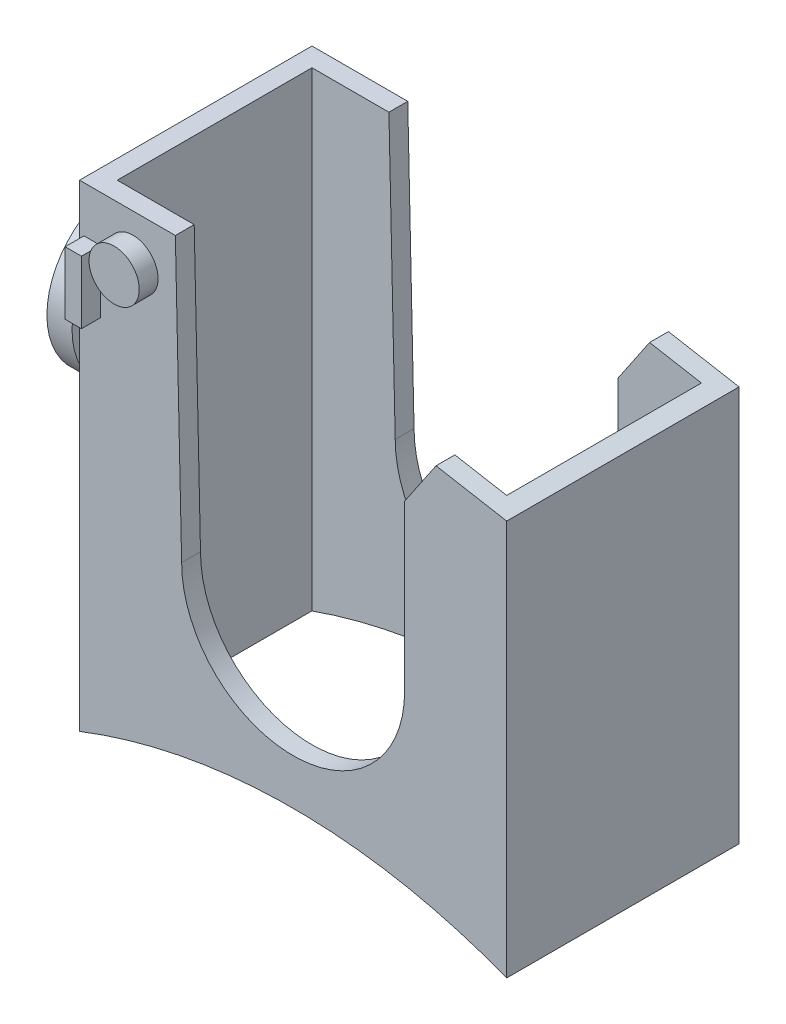
ISO-10303-21;
HEADER;
FILE_DESCRIPTION(('STEP AP214'),'2;1');
FILE_NAME('part.step','',(''),(''),'','','');
FILE_SCHEMA(('AUTOMOTIVE_DESIGN { 1 0 10303 214 1 1 1 1 }'));
ENDSEC;
DATA;
#1=APPLICATION_CONTEXT('core data for automotive mechanical design processes');
#2=APPLICATION_PROTOCOL_DEFINITION('international standard','automotive_design',2000,#1);
#3=PRODUCT_CONTEXT('',#1,'mechanical');
#4=PRODUCT('Part','Part','',(#3));
#5=PRODUCT_RELATED_PRODUCT_CATEGORY('part','',(#4));
#6=PRODUCT_DEFINITION_FORMATION('','',#4);
#7=PRODUCT_DEFINITION_CONTEXT('part definition',#1,'design');
#8=PRODUCT_DEFINITION('design','',#6,#7);
#9=PRODUCT_DEFINITION_SHAPE('','',#8);
#10=(LENGTH_UNIT() NAMED_UNIT(*) SI_UNIT(.MILLI.,.METRE.));
#11=(NAMED_UNIT(*) PLANE_ANGLE_UNIT() SI_UNIT($,.RADIAN.));
#12=(NAMED_UNIT(*) SI_UNIT($,.STERADIAN.) SOLID_ANGLE_UNIT());
#13=UNCERTAINTY_MEASURE_WITH_UNIT(LENGTH_MEASURE(1.E-05),#10,'distance_accuracy_value','');
#14=(GEOMETRIC_REPRESENTATION_CONTEXT(3) GLOBAL_UNCERTAINTY_ASSIGNED_CONTEXT((#13)) GLOBAL_UNIT_ASSIGNED_CONTEXT((#10,
#11,#12)) REPRESENTATION_CONTEXT('',''));
#15=CARTESIAN_POINT('',(0.,0.,0.));
#16=DIRECTION('',(0.,0.,1.));
#17=DIRECTION('',(1.,0.,0.));
#18=AXIS2_PLACEMENT_3D('',#15,#16,#17);
#19=CARTESIAN_POINT('',(0.,0.,18.5));
#20=DIRECTION('',(0.,0.,1.));
#21=DIRECTION('',(1.,0.,0.));
#22=AXIS2_PLACEMENT_3D('',#19,#20,#21);
#23=PLANE('',#22);
#24=CARTESIAN_POINT('',(-25.5,37.27,18.5));
#25=DIRECTION('',(0.,0.,1.));
#26=DIRECTION('',(1.,0.,0.));
#27=AXIS2_PLACEMENT_3D('',#24,#25,#26);
#28=CIRCLE('',#27,4.);
#29=CARTESIAN_POINT('',(-21.5,37.27,18.5));
#30=VERTEX_POINT('',#29);
#31=EDGE_CURVE('E813',#30,#30,#28,.T.);
#32=ORIENTED_EDGE('',*,*,#31,.F.);
#33=EDGE_LOOP('',(#32));
#34=FACE_BOUND('',#33,.T.);
#35=DIRECTION('',(-1.,0.,0.));
#36=VECTOR('',#35,1.);
#37=CARTESIAN_POINT('',(-34.,44.6,18.5));
#38=LINE('',#37,#36);
#39=CARTESIAN_POINT('',(-18.75,44.6,18.5));
#40=VERTEX_POINT('',#39);
#41=CARTESIAN_POINT('',(-34.,44.6,18.5));
#42=VERTEX_POINT('',#41);
#43=EDGE_CURVE('E309',#40,#42,#38,.T.);
#44=ORIENTED_EDGE('',*,*,#43,.T.);
#45=DIRECTION('',(0.,-1.,0.));
#46=VECTOR('',#45,1.);
#47=CARTESIAN_POINT('',(-34.,44.6,18.5));
#48=LINE('',#47,#46);
#49=CARTESIAN_POINT('',(-34.,-31.4,18.5));
#50=VERTEX_POINT('',#49);
#51=EDGE_CURVE('E313',#42,#50,#48,.T.);
#52=ORIENTED_EDGE('',*,*,#51,.T.);
#53=CARTESIAN_POINT('',(0.,-118.5125,18.5));
#54=DIRECTION('',(0.,0.,-1.));
#55=DIRECTION('',(-1.,0.,0.));
#56=AXIS2_PLACEMENT_3D('',#53,#54,#55);
#57=CIRCLE('',#56,93.5124999999999);
#58=CARTESIAN_POINT('',(34.,-31.4,18.5));
#59=VERTEX_POINT('',#58);
#60=EDGE_CURVE('E317',#50,#59,#57,.T.);
#61=ORIENTED_EDGE('',*,*,#60,.T.);
#62=DIRECTION('',(0.,1.,0.));
#63=VECTOR('',#62,1.);
#64=CARTESIAN_POINT('',(34.,-31.4,18.5));
#65=LINE('',#64,#63);
#66=CARTESIAN_POINT('',(34.,31.6,18.5));
#67=VERTEX_POINT('',#66);
#68=EDGE_CURVE('E320',#59,#67,#65,.T.);
#69=ORIENTED_EDGE('',*,*,#68,.T.);
#70=DIRECTION('',(-0.984562507785907,0.175033334717493,0.));
#71=VECTOR('',#70,1.);
#72=CARTESIAN_POINT('',(22.75,33.6,18.5));
#73=LINE('',#72,#71);
#74=CARTESIAN_POINT('',(22.75,33.6,18.5));
#75=VERTEX_POINT('',#74);
#76=EDGE_CURVE('E323',#67,#75,#73,.T.);
#77=ORIENTED_EDGE('',*,*,#76,.T.);
#78=DIRECTION('',(-0.560657409563094,-0.828047866431646,0.));
#79=VECTOR('',#78,1.);
#80=CARTESIAN_POINT('',(17.75,26.2153846153846,18.5));
#81=LINE('',#80,#79);
#82=CARTESIAN_POINT('',(17.75,26.2153846153846,18.5));
#83=VERTEX_POINT('',#82);
#84=EDGE_CURVE('E326',#75,#83,#81,.T.);
#85=ORIENTED_EDGE('',*,*,#84,.T.);
#86=DIRECTION('',(0.,-1.,0.));
#87=VECTOR('',#86,1.);
#88=CARTESIAN_POINT('',(17.75,0.,18.5));
#89=LINE('',#88,#87);
#90=CARTESIAN_POINT('',(17.75,0.,18.5));
#91=VERTEX_POINT('',#90);
#92=EDGE_CURVE('E329',#83,#91,#89,.T.);
#93=ORIENTED_EDGE('',*,*,#92,.T.);
#94=CARTESIAN_POINT('',(0.,0.,18.5));
#95=DIRECTION('',(0.,0.,-1.));
#96=DIRECTION('',(1.,0.,0.));
#97=AXIS2_PLACEMENT_3D('',#94,#95,#96);
#98=CIRCLE('',#97,17.75);
#99=CARTESIAN_POINT('',(-17.75,0.,18.5));
#100=VERTEX_POINT('',#99);
#101=EDGE_CURVE('E332',#91,#100,#98,.T.);
#102=ORIENTED_EDGE('',*,*,#101,.T.);
#103=DIRECTION('',(-0.022415890859883,0.999748732350763,0.));
#104=VECTOR('',#103,1.);
#105=CARTESIAN_POINT('',(-18.75,44.6,18.5));
#106=LINE('',#105,#104);
#107=EDGE_CURVE('E335',#100,#40,#106,.T.);
#108=ORIENTED_EDGE('',*,*,#107,.T.);
#109=EDGE_LOOP('',(#44,#52,#61,#69,#77,#85,#93,#102,#108));
#110=FACE_BOUND('',#109,.T.);
#111=DIRECTION('',(1.,0.,0.));
#112=VECTOR('',#111,1.);
#113=CARTESIAN_POINT('',(-33.3,27.27,18.5));
#114=LINE('',#113,#112);
#115=CARTESIAN_POINT('',(-33.3,27.27,18.5));
#116=VERTEX_POINT('',#115);
#117=CARTESIAN_POINT('',(-30.7,27.27,18.5));
#118=VERTEX_POINT('',#117);
#119=EDGE_CURVE('E817',#116,#118,#114,.T.);
#120=ORIENTED_EDGE('',*,*,#119,.F.);
#121=DIRECTION('',(0.,-1.,0.));
#122=VECTOR('',#121,1.);
#123=CARTESIAN_POINT('',(-33.3,37.27,18.5));
#124=LINE('',#123,#122);
#125=CARTESIAN_POINT('',(-33.3,37.27,18.5));
#126=VERTEX_POINT('',#125);
#127=EDGE_CURVE('E213',#126,#116,#124,.T.);
#128=ORIENTED_EDGE('',*,*,#127,.F.);
#129=DIRECTION('',(-1.,0.,0.));
#130=VECTOR('',#129,1.);
#131=CARTESIAN_POINT('',(-33.3,37.27,18.5));
#132=LINE('',#131,#130);
#133=CARTESIAN_POINT('',(-30.7,37.27,18.5));
#134=VERTEX_POINT('',#133);
#135=EDGE_CURVE('E209',#134,#126,#132,.T.);
#136=ORIENTED_EDGE('',*,*,#135,.F.);
#137=DIRECTION('',(0.,1.,0.));
#138=VECTOR('',#137,1.);
#139=CARTESIAN_POINT('',(-30.7,37.27,18.5));
#140=LINE('',#139,#138);
#141=EDGE_CURVE('E829',#118,#134,#140,.T.);
#142=ORIENTED_EDGE('',*,*,#141,.F.);
#143=EDGE_LOOP('',(#120,#128,#136,#142));
#144=FACE_BOUND('',#143,.T.);
#145=ADVANCED_FACE('F39',(#34,#110,#144),#23,.T.);
#146=CARTESIAN_POINT('',(-34.,44.6,18.5));
#147=DIRECTION('',(0.,-1.,0.));
#148=DIRECTION('',(0.,0.,-1.));
#149=AXIS2_PLACEMENT_3D('',#146,#147,#148);
#150=PLANE('',#149);
#151=DIRECTION('',(1.,0.,0.));
#152=VECTOR('',#151,1.);
#153=CARTESIAN_POINT('',(-34.,44.6,15.5));
#154=LINE('',#153,#152);
#155=CARTESIAN_POINT('',(-31.,44.6,15.5));
#156=VERTEX_POINT('',#155);
#157=CARTESIAN_POINT('',(-18.75,44.6,15.5));
#158=VERTEX_POINT('',#157);
#159=EDGE_CURVE('E295',#156,#158,#154,.T.);
#160=ORIENTED_EDGE('',*,*,#159,.F.);
#161=DIRECTION('',(0.,0.,1.));
#162=VECTOR('',#161,1.);
#163=CARTESIAN_POINT('',(-31.,44.6,18.5));
#164=LINE('',#163,#162);
#165=CARTESIAN_POINT('',(-31.,44.6,-15.5));
#166=VERTEX_POINT('',#165);
#167=EDGE_CURVE('E305',#166,#156,#164,.T.);
#168=ORIENTED_EDGE('',*,*,#167,.F.);
#169=DIRECTION('',(1.,0.,0.));
#170=VECTOR('',#169,1.);
#171=CARTESIAN_POINT('',(-34.,44.6,-15.5));
#172=LINE('',#171,#170);
#173=CARTESIAN_POINT('',(-18.75,44.6,-15.5));
#174=VERTEX_POINT('',#173);
#175=EDGE_CURVE('E275',#166,#174,#172,.T.);
#176=ORIENTED_EDGE('',*,*,#175,.T.);
#177=DIRECTION('',(0.,0.,-1.));
#178=VECTOR('',#177,1.);
#179=CARTESIAN_POINT('',(-18.75,44.6,18.5));
#180=LINE('',#179,#178);
#181=CARTESIAN_POINT('',(-18.75,44.6,-18.5));
#182=VERTEX_POINT('',#181);
#183=EDGE_CURVE('E338',#174,#182,#180,.T.);
#184=ORIENTED_EDGE('',*,*,#183,.T.);
#185=DIRECTION('',(-1.,0.,0.));
#186=VECTOR('',#185,1.);
#187=CARTESIAN_POINT('',(-34.,44.6,-18.5));
#188=LINE('',#187,#186);
#189=CARTESIAN_POINT('',(-34.,44.6,-18.5));
#190=VERTEX_POINT('',#189);
#191=EDGE_CURVE('E308',#182,#190,#188,.T.);
#192=ORIENTED_EDGE('',*,*,#191,.T.);
#193=DIRECTION('',(0.,0.,-1.));
#194=VECTOR('',#193,1.);
#195=CARTESIAN_POINT('',(-34.,44.6,18.5));
#196=LINE('',#195,#194);
#197=EDGE_CURVE('E406',#42,#190,#196,.T.);
#198=ORIENTED_EDGE('',*,*,#197,.F.);
#199=ORIENTED_EDGE('',*,*,#43,.F.);
#200=EDGE_CURVE('E370',#40,#158,#180,.T.);
#201=ORIENTED_EDGE('',*,*,#200,.T.);
#202=EDGE_LOOP('',(#160,#168,#176,#184,#192,#198,#199,#201));
#203=FACE_BOUND('',#202,.T.);
#204=ADVANCED_FACE('F41',(#203),#150,.F.);
#205=CARTESIAN_POINT('',(0.,-118.5125,18.5));
#206=DIRECTION('',(0.,0.,-1.));
#207=DIRECTION('',(-1.,0.,0.));
#208=AXIS2_PLACEMENT_3D('',#205,#206,#207);
#209=CYLINDRICAL_SURFACE('',#208,93.5124999999999);
#210=CARTESIAN_POINT('',(0.,-118.5125,-18.5));
#211=DIRECTION('',(0.,0.,-1.));
#212=DIRECTION('',(-1.,0.,0.));
#213=AXIS2_PLACEMENT_3D('',#210,#211,#212);
#214=CIRCLE('',#213,93.5124999999999);
#215=CARTESIAN_POINT('',(-34.,-31.4,-18.5));
#216=VERTEX_POINT('',#215);
#217=CARTESIAN_POINT('',(34.,-31.4,-18.5));
#218=VERTEX_POINT('',#217);
#219=EDGE_CURVE('E345',#216,#218,#214,.T.);
#220=ORIENTED_EDGE('',*,*,#219,.T.);
#221=DIRECTION('',(0.,0.,-1.));
#222=VECTOR('',#221,1.);
#223=CARTESIAN_POINT('',(34.,-31.4,18.5));
#224=LINE('',#223,#222);
#225=EDGE_CURVE('E398',#59,#218,#224,.T.);
#226=ORIENTED_EDGE('',*,*,#225,.F.);
#227=ORIENTED_EDGE('',*,*,#60,.F.);
#228=DIRECTION('',(0.,0.,-1.));
#229=VECTOR('',#228,1.);
#230=CARTESIAN_POINT('',(-34.,-31.4,18.5));
#231=LINE('',#230,#229);
#232=EDGE_CURVE('E402',#50,#216,#231,.T.);
#233=ORIENTED_EDGE('',*,*,#232,.T.);
#234=EDGE_LOOP('',(#220,#226,#227,#233));
#235=FACE_BOUND('',#234,.T.);
#236=CARTESIAN_POINT('',(0.,-118.5125,15.5));
#237=DIRECTION('',(0.,0.,-1.));
#238=DIRECTION('',(-1.,0.,0.));
#239=AXIS2_PLACEMENT_3D('',#236,#237,#238);
#240=CIRCLE('',#239,93.5124999999999);
#241=CARTESIAN_POINT('',(31.,-30.2878568652726,15.5));
#242=VERTEX_POINT('',#241);
#243=CARTESIAN_POINT('',(-31.,-30.2878568652726,15.5));
#244=VERTEX_POINT('',#243);
#245=EDGE_CURVE('E298',#242,#244,#240,.F.);
#246=ORIENTED_EDGE('',*,*,#245,.F.);
#247=DIRECTION('',(0.,0.,-1.));
#248=VECTOR('',#247,1.);
#249=CARTESIAN_POINT('',(31.,-30.2878568652726,18.5));
#250=LINE('',#249,#248);
#251=CARTESIAN_POINT('',(31.,-30.2878568652726,-15.5));
#252=VERTEX_POINT('',#251);
#253=EDGE_CURVE('E301',#242,#252,#250,.T.);
#254=ORIENTED_EDGE('',*,*,#253,.T.);
#255=CARTESIAN_POINT('',(0.,-118.5125,-15.5));
#256=DIRECTION('',(0.,0.,-1.));
#257=DIRECTION('',(-1.,0.,0.));
#258=AXIS2_PLACEMENT_3D('',#255,#256,#257);
#259=CIRCLE('',#258,93.5124999999999);
#260=CARTESIAN_POINT('',(-31.,-30.2878568652726,-15.5));
#261=VERTEX_POINT('',#260);
#262=EDGE_CURVE('E279',#252,#261,#259,.F.);
#263=ORIENTED_EDGE('',*,*,#262,.T.);
#264=DIRECTION('',(0.,0.,-1.));
#265=VECTOR('',#264,1.);
#266=CARTESIAN_POINT('',(-31.,-30.2878568652726,18.5));
#267=LINE('',#266,#265);
#268=EDGE_CURVE('E11',#244,#261,#267,.T.);
#269=ORIENTED_EDGE('',*,*,#268,.F.);
#270=EDGE_LOOP('',(#246,#254,#263,#269));
#271=FACE_BOUND('',#270,.T.);
#272=ADVANCED_FACE('F431',(#235,#271),#209,.F.);
#273=CARTESIAN_POINT('',(22.75,33.6,18.5));
#274=DIRECTION('',(-0.175033334717493,-0.984562507785907,0.));
#275=DIRECTION('',(0.984562507785907,-0.175033334717493,0.));
#276=AXIS2_PLACEMENT_3D('',#273,#274,#275);
#277=PLANE('',#276);
#278=DIRECTION('',(0.984562507785907,-0.175033334717493,0.));
#279=VECTOR('',#278,1.);
#280=CARTESIAN_POINT('',(22.75,33.6,15.5));
#281=LINE('',#280,#279);
#282=CARTESIAN_POINT('',(22.75,33.6,15.5));
#283=VERTEX_POINT('',#282);
#284=CARTESIAN_POINT('',(31.,32.1333333333333,15.5));
#285=VERTEX_POINT('',#284);
#286=EDGE_CURVE('E292',#283,#285,#281,.T.);
#287=ORIENTED_EDGE('',*,*,#286,.F.);
#288=DIRECTION('',(0.,0.,-1.));
#289=VECTOR('',#288,1.);
#290=CARTESIAN_POINT('',(22.75,33.6,18.5));
#291=LINE('',#290,#289);
#292=EDGE_CURVE('E390',#75,#283,#291,.T.);
#293=ORIENTED_EDGE('',*,*,#292,.F.);
#294=ORIENTED_EDGE('',*,*,#76,.F.);
#295=DIRECTION('',(0.,0.,-1.));
#296=VECTOR('',#295,1.);
#297=CARTESIAN_POINT('',(34.,31.6,18.5));
#298=LINE('',#297,#296);
#299=CARTESIAN_POINT('',(34.,31.6,-18.5));
#300=VERTEX_POINT('',#299);
#301=EDGE_CURVE('E394',#67,#300,#298,.T.);
#302=ORIENTED_EDGE('',*,*,#301,.T.);
#303=DIRECTION('',(-0.984562507785907,0.175033334717493,0.));
#304=VECTOR('',#303,1.);
#305=CARTESIAN_POINT('',(22.75,33.6,-18.5));
#306=LINE('',#305,#304);
#307=CARTESIAN_POINT('',(22.75,33.6,-18.5));
#308=VERTEX_POINT('',#307);
#309=EDGE_CURVE('E351',#300,#308,#306,.T.);
#310=ORIENTED_EDGE('',*,*,#309,.T.);
#311=CARTESIAN_POINT('',(22.75,33.6,-15.5));
#312=VERTEX_POINT('',#311);
#313=EDGE_CURVE('E389',#312,#308,#291,.T.);
#314=ORIENTED_EDGE('',*,*,#313,.F.);
#315=DIRECTION('',(0.984562507785907,-0.175033334717493,0.));
#316=VECTOR('',#315,1.);
#317=CARTESIAN_POINT('',(22.75,33.6,-15.5));
#318=LINE('',#317,#316);
#319=CARTESIAN_POINT('',(31.,32.1333333333333,-15.5));
#320=VERTEX_POINT('',#319);
#321=EDGE_CURVE('E271',#312,#320,#318,.T.);
#322=ORIENTED_EDGE('',*,*,#321,.T.);
#323=DIRECTION('',(0.,0.,1.));
#324=VECTOR('',#323,1.);
#325=CARTESIAN_POINT('',(31.,32.1333333333333,18.5));
#326=LINE('',#325,#324);
#327=EDGE_CURVE('E48',#320,#285,#326,.T.);
#328=ORIENTED_EDGE('',*,*,#327,.T.);
#329=EDGE_LOOP('',(#287,#293,#294,#302,#310,#314,#322,#328));
#330=FACE_BOUND('',#329,.T.);
#331=ADVANCED_FACE('F420',(#330),#277,.F.);
#332=CARTESIAN_POINT('',(17.75,26.2153846153846,18.5));
#333=DIRECTION('',(0.828047866431646,-0.560657409563094,0.));
#334=DIRECTION('',(0.560657409563094,0.828047866431646,0.));
#335=AXIS2_PLACEMENT_3D('',#332,#333,#334);
#336=PLANE('',#335);
#337=DIRECTION('',(0.560657409563094,0.828047866431646,0.));
#338=VECTOR('',#337,1.);
#339=CARTESIAN_POINT('',(17.75,26.2153846153846,15.5));
#340=LINE('',#339,#338);
#341=CARTESIAN_POINT('',(17.75,26.2153846153846,15.5));
#342=VERTEX_POINT('',#341);
#343=EDGE_CURVE('E289',#342,#283,#340,.T.);
#344=ORIENTED_EDGE('',*,*,#343,.F.);
#345=DIRECTION('',(0.,0.,-1.));
#346=VECTOR('',#345,1.);
#347=CARTESIAN_POINT('',(17.75,26.2153846153846,18.5));
#348=LINE('',#347,#346);
#349=EDGE_CURVE('E385',#83,#342,#348,.T.);
#350=ORIENTED_EDGE('',*,*,#349,.F.);
#351=ORIENTED_EDGE('',*,*,#84,.F.);
#352=ORIENTED_EDGE('',*,*,#292,.T.);
#353=EDGE_LOOP('',(#344,#350,#351,#352));
#354=FACE_BOUND('',#353,.T.);
#355=ADVANCED_FACE('F439',(#354),#336,.F.);
#356=CARTESIAN_POINT('',(17.75,0.,18.5));
#357=DIRECTION('',(1.,0.,0.));
#358=DIRECTION('',(0.,1.,0.));
#359=AXIS2_PLACEMENT_3D('',#356,#357,#358);
#360=PLANE('',#359);
#361=DIRECTION('',(0.,1.,0.));
#362=VECTOR('',#361,1.);
#363=CARTESIAN_POINT('',(17.75,0.,15.5));
#364=LINE('',#363,#362);
#365=CARTESIAN_POINT('',(17.75,0.,15.5));
#366=VERTEX_POINT('',#365);
#367=EDGE_CURVE('E286',#366,#342,#364,.T.);
#368=ORIENTED_EDGE('',*,*,#367,.F.);
#369=DIRECTION('',(0.,0.,-1.));
#370=VECTOR('',#369,1.);
#371=CARTESIAN_POINT('',(17.75,0.,18.5));
#372=LINE('',#371,#370);
#373=EDGE_CURVE('E380',#91,#366,#372,.T.);
#374=ORIENTED_EDGE('',*,*,#373,.F.);
#375=ORIENTED_EDGE('',*,*,#92,.F.);
#376=ORIENTED_EDGE('',*,*,#349,.T.);
#377=EDGE_LOOP('',(#368,#374,#375,#376));
#378=FACE_BOUND('',#377,.T.);
#379=ADVANCED_FACE('F443',(#378),#360,.F.);
#380=CARTESIAN_POINT('',(0.,0.,18.5));
#381=DIRECTION('',(0.,0.,-1.));
#382=DIRECTION('',(-1.,0.,0.));
#383=AXIS2_PLACEMENT_3D('',#380,#381,#382);
#384=CYLINDRICAL_SURFACE('',#383,17.75);
#385=CARTESIAN_POINT('',(0.,0.,15.5));
#386=DIRECTION('',(0.,0.,-1.));
#387=DIRECTION('',(-1.,0.,0.));
#388=AXIS2_PLACEMENT_3D('',#385,#386,#387);
#389=CIRCLE('',#388,17.75);
#390=CARTESIAN_POINT('',(-17.75,0.,15.5));
#391=VERTEX_POINT('',#390);
#392=EDGE_CURVE('E283',#391,#366,#389,.F.);
#393=ORIENTED_EDGE('',*,*,#392,.F.);
#394=DIRECTION('',(0.,0.,-1.));
#395=VECTOR('',#394,1.);
#396=CARTESIAN_POINT('',(-17.75,0.,18.5));
#397=LINE('',#396,#395);
#398=EDGE_CURVE('E375',#100,#391,#397,.T.);
#399=ORIENTED_EDGE('',*,*,#398,.F.);
#400=ORIENTED_EDGE('',*,*,#101,.F.);
#401=ORIENTED_EDGE('',*,*,#373,.T.);
#402=EDGE_LOOP('',(#393,#399,#400,#401));
#403=FACE_BOUND('',#402,.T.);
#404=ADVANCED_FACE('F490',(#403),#384,.F.);
#405=CARTESIAN_POINT('',(-18.75,44.6,18.5));
#406=DIRECTION('',(-0.999748732350763,-0.022415890859883,0.));
#407=DIRECTION('',(0.022415890859883,-0.999748732350763,0.));
#408=AXIS2_PLACEMENT_3D('',#405,#406,#407);
#409=PLANE('',#408);
#410=DIRECTION('',(0.022415890859883,-0.999748732350763,0.));
#411=VECTOR('',#410,1.);
#412=CARTESIAN_POINT('',(-18.75,44.6,15.5));
#413=LINE('',#412,#411);
#414=EDGE_CURVE('E414',#158,#391,#413,.T.);
#415=ORIENTED_EDGE('',*,*,#414,.F.);
#416=ORIENTED_EDGE('',*,*,#200,.F.);
#417=ORIENTED_EDGE('',*,*,#107,.F.);
#418=ORIENTED_EDGE('',*,*,#398,.T.);
#419=EDGE_LOOP('',(#415,#416,#417,#418));
#420=FACE_BOUND('',#419,.T.);
#421=ADVANCED_FACE('F487',(#420),#409,.F.);
#422=CARTESIAN_POINT('',(-34.,44.6,18.5));
#423=DIRECTION('',(1.,0.,0.));
#424=DIRECTION('',(0.,1.,0.));
#425=AXIS2_PLACEMENT_3D('',#422,#423,#424);
#426=PLANE('',#425);
#427=CARTESIAN_POINT('',(-34.,17.6,0.));
#428=DIRECTION('',(1.,0.,0.));
#429=DIRECTION('',(0.,1.,0.));
#430=AXIS2_PLACEMENT_3D('',#427,#428,#429);
#431=CIRCLE('',#430,14.);
#432=CARTESIAN_POINT('',(-34.,31.6,0.));
#433=VERTEX_POINT('',#432);
#434=EDGE_CURVE('E241',#433,#433,#431,.T.);
#435=ORIENTED_EDGE('',*,*,#434,.T.);
#436=EDGE_LOOP('',(#435));
#437=FACE_BOUND('',#436,.T.);
#438=DIRECTION('',(0.,-1.,0.));
#439=VECTOR('',#438,1.);
#440=CARTESIAN_POINT('',(-34.,44.6,-18.5));
#441=LINE('',#440,#439);
#442=EDGE_CURVE('E342',#190,#216,#441,.T.);
#443=ORIENTED_EDGE('',*,*,#442,.T.);
#444=ORIENTED_EDGE('',*,*,#232,.F.);
#445=ORIENTED_EDGE('',*,*,#51,.F.);
#446=ORIENTED_EDGE('',*,*,#197,.T.);
#447=EDGE_LOOP('',(#443,#444,#445,#446));
#448=FACE_BOUND('',#447,.T.);
#449=ADVANCED_FACE('F481',(#437,#448),#426,.F.);
#450=CARTESIAN_POINT('',(34.,-31.4,18.5));
#451=DIRECTION('',(-1.,0.,0.));
#452=DIRECTION('',(0.,0.,1.));
#453=AXIS2_PLACEMENT_3D('',#450,#451,#452);
#454=PLANE('',#453);
#455=DIRECTION('',(0.,1.,0.));
#456=VECTOR('',#455,1.);
#457=CARTESIAN_POINT('',(34.,-31.4,-18.5));
#458=LINE('',#457,#456);
#459=EDGE_CURVE('E348',#218,#300,#458,.T.);
#460=ORIENTED_EDGE('',*,*,#459,.T.);
#461=ORIENTED_EDGE('',*,*,#301,.F.);
#462=ORIENTED_EDGE('',*,*,#68,.F.);
#463=ORIENTED_EDGE('',*,*,#225,.T.);
#464=EDGE_LOOP('',(#460,#461,#462,#463));
#465=FACE_BOUND('',#464,.T.);
#466=ADVANCED_FACE('F772',(#465),#454,.F.);
#467=CARTESIAN_POINT('',(17.75,26.2153846153846,-15.5));
#468=VERTEX_POINT('',#467);
#469=CARTESIAN_POINT('',(17.75,26.2153846153846,-18.5));
#470=VERTEX_POINT('',#469);
#471=EDGE_CURVE('E384',#468,#470,#348,.T.);
#472=ORIENTED_EDGE('',*,*,#471,.F.);
#473=DIRECTION('',(0.560657409563094,0.828047866431646,0.));
#474=VECTOR('',#473,1.);
#475=CARTESIAN_POINT('',(17.75,26.2153846153846,-15.5));
#476=LINE('',#475,#474);
#477=EDGE_CURVE('E267',#468,#312,#476,.T.);
#478=ORIENTED_EDGE('',*,*,#477,.T.);
#479=ORIENTED_EDGE('',*,*,#313,.T.);
#480=DIRECTION('',(-0.560657409563094,-0.828047866431646,0.));
#481=VECTOR('',#480,1.);
#482=CARTESIAN_POINT('',(17.75,26.2153846153846,-18.5));
#483=LINE('',#482,#481);
#484=EDGE_CURVE('E355',#308,#470,#483,.T.);
#485=ORIENTED_EDGE('',*,*,#484,.T.);
#486=EDGE_LOOP('',(#472,#478,#479,#485));
#487=FACE_BOUND('',#486,.T.);
#488=ADVANCED_FACE('F464',(#487),#336,.F.);
#489=CARTESIAN_POINT('',(17.75,0.,-15.5));
#490=VERTEX_POINT('',#489);
#491=CARTESIAN_POINT('',(17.75,0.,-18.5));
#492=VERTEX_POINT('',#491);
#493=EDGE_CURVE('E379',#490,#492,#372,.T.);
#494=ORIENTED_EDGE('',*,*,#493,.F.);
#495=DIRECTION('',(0.,1.,0.));
#496=VECTOR('',#495,1.);
#497=CARTESIAN_POINT('',(17.75,0.,-15.5));
#498=LINE('',#497,#496);
#499=EDGE_CURVE('E263',#490,#468,#498,.T.);
#500=ORIENTED_EDGE('',*,*,#499,.T.);
#501=ORIENTED_EDGE('',*,*,#471,.T.);
#502=DIRECTION('',(0.,-1.,0.));
#503=VECTOR('',#502,1.);
#504=CARTESIAN_POINT('',(17.75,0.,-18.5));
#505=LINE('',#504,#503);
#506=EDGE_CURVE('E359',#470,#492,#505,.T.);
#507=ORIENTED_EDGE('',*,*,#506,.T.);
#508=EDGE_LOOP('',(#494,#500,#501,#507));
#509=FACE_BOUND('',#508,.T.);
#510=ADVANCED_FACE('F500',(#509),#360,.F.);
#511=CARTESIAN_POINT('',(-17.75,0.,-15.5));
#512=VERTEX_POINT('',#511);
#513=CARTESIAN_POINT('',(-17.75,0.,-18.5));
#514=VERTEX_POINT('',#513);
#515=EDGE_CURVE('E374',#512,#514,#397,.T.);
#516=ORIENTED_EDGE('',*,*,#515,.F.);
#517=CARTESIAN_POINT('',(0.,0.,-15.5));
#518=DIRECTION('',(0.,0.,-1.));
#519=DIRECTION('',(-1.,0.,0.));
#520=AXIS2_PLACEMENT_3D('',#517,#518,#519);
#521=CIRCLE('',#520,17.75);
#522=EDGE_CURVE('E250',#512,#490,#521,.F.);
#523=ORIENTED_EDGE('',*,*,#522,.T.);
#524=ORIENTED_EDGE('',*,*,#493,.T.);
#525=CARTESIAN_POINT('',(0.,0.,-18.5));
#526=DIRECTION('',(0.,0.,-1.));
#527=DIRECTION('',(1.,0.,0.));
#528=AXIS2_PLACEMENT_3D('',#525,#526,#527);
#529=CIRCLE('',#528,17.75);
#530=EDGE_CURVE('E363',#492,#514,#529,.T.);
#531=ORIENTED_EDGE('',*,*,#530,.T.);
#532=EDGE_LOOP('',(#516,#523,#524,#531));
#533=FACE_BOUND('',#532,.T.);
#534=ADVANCED_FACE('F493',(#533),#384,.F.);
#535=ORIENTED_EDGE('',*,*,#183,.F.);
#536=DIRECTION('',(0.022415890859883,-0.999748732350763,0.));
#537=VECTOR('',#536,1.);
#538=CARTESIAN_POINT('',(-18.75,44.6,-15.5));
#539=LINE('',#538,#537);
#540=EDGE_CURVE('E410',#174,#512,#539,.T.);
#541=ORIENTED_EDGE('',*,*,#540,.T.);
#542=ORIENTED_EDGE('',*,*,#515,.T.);
#543=DIRECTION('',(-0.022415890859883,0.999748732350763,0.));
#544=VECTOR('',#543,1.);
#545=CARTESIAN_POINT('',(-18.75,44.6,-18.5));
#546=LINE('',#545,#544);
#547=EDGE_CURVE('E314',#514,#182,#546,.T.);
#548=ORIENTED_EDGE('',*,*,#547,.T.);
#549=EDGE_LOOP('',(#535,#541,#542,#548));
#550=FACE_BOUND('',#549,.T.);
#551=ADVANCED_FACE('F477',(#550),#409,.F.);
#552=CARTESIAN_POINT('',(0.,0.,-18.5));
#553=DIRECTION('',(0.,0.,1.));
#554=DIRECTION('',(1.,0.,0.));
#555=AXIS2_PLACEMENT_3D('',#552,#553,#554);
#556=PLANE('',#555);
#557=ORIENTED_EDGE('',*,*,#191,.F.);
#558=ORIENTED_EDGE('',*,*,#547,.F.);
#559=ORIENTED_EDGE('',*,*,#530,.F.);
#560=ORIENTED_EDGE('',*,*,#506,.F.);
#561=ORIENTED_EDGE('',*,*,#484,.F.);
#562=ORIENTED_EDGE('',*,*,#309,.F.);
#563=ORIENTED_EDGE('',*,*,#459,.F.);
#564=ORIENTED_EDGE('',*,*,#219,.F.);
#565=ORIENTED_EDGE('',*,*,#442,.F.);
#566=EDGE_LOOP('',(#557,#558,#559,#560,#561,#562,#563,#564,#565));
#567=FACE_BOUND('',#566,.T.);
#568=ADVANCED_FACE('F458',(#567),#556,.F.);
#569=CARTESIAN_POINT('',(-31.,-53.5,0.));
#570=DIRECTION('',(1.,0.,0.));
#571=DIRECTION('',(0.,0.,-1.));
#572=AXIS2_PLACEMENT_3D('',#569,#570,#571);
#573=PLANE('',#572);
#574=ORIENTED_EDGE('',*,*,#167,.T.);
#575=DIRECTION('',(0.,1.,0.));
#576=VECTOR('',#575,1.);
#577=CARTESIAN_POINT('',(-31.,-53.5,15.5));
#578=LINE('',#577,#576);
#579=EDGE_CURVE('E246',#244,#156,#578,.T.);
#580=ORIENTED_EDGE('',*,*,#579,.F.);
#581=ORIENTED_EDGE('',*,*,#268,.T.);
#582=DIRECTION('',(0.,1.,0.));
#583=VECTOR('',#582,1.);
#584=CARTESIAN_POINT('',(-31.,-53.5,-15.5));
#585=LINE('',#584,#583);
#586=EDGE_CURVE('E251',#261,#166,#585,.T.);
#587=ORIENTED_EDGE('',*,*,#586,.T.);
#588=EDGE_LOOP('',(#574,#580,#581,#587));
#589=FACE_BOUND('',#588,.T.);
#590=ADVANCED_FACE('F514',(#589),#573,.T.);
#591=CARTESIAN_POINT('',(31.,-53.5,0.));
#592=DIRECTION('',(1.,0.,0.));
#593=DIRECTION('',(0.,0.,-1.));
#594=AXIS2_PLACEMENT_3D('',#591,#592,#593);
#595=PLANE('',#594);
#596=DIRECTION('',(0.,1.,0.));
#597=VECTOR('',#596,1.);
#598=CARTESIAN_POINT('',(31.,-53.5,15.5));
#599=LINE('',#598,#597);
#600=EDGE_CURVE('E245',#242,#285,#599,.T.);
#601=ORIENTED_EDGE('',*,*,#600,.T.);
#602=ORIENTED_EDGE('',*,*,#327,.F.);
#603=DIRECTION('',(0.,1.,0.));
#604=VECTOR('',#603,1.);
#605=CARTESIAN_POINT('',(31.,-53.5,-15.5));
#606=LINE('',#605,#604);
#607=EDGE_CURVE('E63',#252,#320,#606,.T.);
#608=ORIENTED_EDGE('',*,*,#607,.F.);
#609=ORIENTED_EDGE('',*,*,#253,.F.);
#610=EDGE_LOOP('',(#601,#602,#608,#609));
#611=FACE_BOUND('',#610,.T.);
#612=ADVANCED_FACE('F423',(#611),#595,.F.);
#613=CARTESIAN_POINT('',(0.,-53.5,15.5));
#614=DIRECTION('',(0.,0.,-1.));
#615=DIRECTION('',(-1.,0.,0.));
#616=AXIS2_PLACEMENT_3D('',#613,#614,#615);
#617=PLANE('',#616);
#618=ORIENTED_EDGE('',*,*,#245,.T.);
#619=ORIENTED_EDGE('',*,*,#579,.T.);
#620=ORIENTED_EDGE('',*,*,#159,.T.);
#621=ORIENTED_EDGE('',*,*,#414,.T.);
#622=ORIENTED_EDGE('',*,*,#392,.T.);
#623=ORIENTED_EDGE('',*,*,#367,.T.);
#624=ORIENTED_EDGE('',*,*,#343,.T.);
#625=ORIENTED_EDGE('',*,*,#286,.T.);
#626=ORIENTED_EDGE('',*,*,#600,.F.);
#627=EDGE_LOOP('',(#618,#619,#620,#621,#622,#623,#624,#625,#626));
#628=FACE_BOUND('',#627,.T.);
#629=ADVANCED_FACE('F433',(#628),#617,.T.);
#630=CARTESIAN_POINT('',(0.,-53.5,-15.5));
#631=DIRECTION('',(0.,0.,-1.));
#632=DIRECTION('',(-1.,0.,0.));
#633=AXIS2_PLACEMENT_3D('',#630,#631,#632);
#634=PLANE('',#633);
#635=ORIENTED_EDGE('',*,*,#607,.T.);
#636=ORIENTED_EDGE('',*,*,#321,.F.);
#637=ORIENTED_EDGE('',*,*,#477,.F.);
#638=ORIENTED_EDGE('',*,*,#499,.F.);
#639=ORIENTED_EDGE('',*,*,#522,.F.);
#640=ORIENTED_EDGE('',*,*,#540,.F.);
#641=ORIENTED_EDGE('',*,*,#175,.F.);
#642=ORIENTED_EDGE('',*,*,#586,.F.);
#643=ORIENTED_EDGE('',*,*,#262,.F.);
#644=EDGE_LOOP('',(#635,#636,#637,#638,#639,#640,#641,#642,#643));
#645=FACE_BOUND('',#644,.T.);
#646=ADVANCED_FACE('F426',(#645),#634,.F.);
#647=CARTESIAN_POINT('',(19.4782293298759,17.6,0.));
#648=DIRECTION('',(1.,0.,0.));
#649=DIRECTION('',(0.,1.,0.));
#650=AXIS2_PLACEMENT_3D('',#647,#648,#649);
#651=CYLINDRICAL_SURFACE('',#650,14.);
#652=ORIENTED_EDGE('',*,*,#434,.F.);
#653=EDGE_LOOP('',(#652));
#654=FACE_BOUND('',#653,.T.);
#655=CARTESIAN_POINT('',(-37.,17.6,0.));
#656=DIRECTION('',(1.,0.,0.));
#657=DIRECTION('',(0.,1.,0.));
#658=AXIS2_PLACEMENT_3D('',#655,#656,#657);
#659=CIRCLE('',#658,14.);
#660=CARTESIAN_POINT('',(-37.,31.6,0.));
#661=VERTEX_POINT('',#660);
#662=EDGE_CURVE('E237',#661,#661,#659,.T.);
#663=ORIENTED_EDGE('',*,*,#662,.T.);
#664=EDGE_LOOP('',(#663));
#665=FACE_BOUND('',#664,.T.);
#666=ADVANCED_FACE('F550',(#654,#665),#651,.T.);
#667=CARTESIAN_POINT('',(-37.,3.59999999999998,0.));
#668=DIRECTION('',(1.,0.,0.));
#669=DIRECTION('',(0.,1.,0.));
#670=AXIS2_PLACEMENT_3D('',#667,#668,#669);
#671=PLANE('',#670);
#672=ORIENTED_EDGE('',*,*,#662,.F.);
#673=EDGE_LOOP('',(#672));
#674=FACE_BOUND('',#673,.T.);
#675=CARTESIAN_POINT('',(-37.,17.6,0.));
#676=DIRECTION('',(1.,0.,0.));
#677=DIRECTION('',(0.,1.,0.));
#678=AXIS2_PLACEMENT_3D('',#675,#676,#677);
#679=CIRCLE('',#678,7.29999999999999);
#680=CARTESIAN_POINT('',(-37.,24.9,0.));
#681=VERTEX_POINT('',#680);
#682=EDGE_CURVE('E233',#681,#681,#679,.T.);
#683=ORIENTED_EDGE('',*,*,#682,.T.);
#684=EDGE_LOOP('',(#683));
#685=FACE_BOUND('',#684,.T.);
#686=ADVANCED_FACE('F558',(#674,#685),#671,.F.);
#687=CARTESIAN_POINT('',(19.4782293298759,17.6,0.));
#688=DIRECTION('',(1.,0.,0.));
#689=DIRECTION('',(0.,1.,0.));
#690=AXIS2_PLACEMENT_3D('',#687,#688,#689);
#691=CYLINDRICAL_SURFACE('',#690,7.29999999999999);
#692=ORIENTED_EDGE('',*,*,#682,.F.);
#693=EDGE_LOOP('',(#692));
#694=FACE_BOUND('',#693,.T.);
#695=CARTESIAN_POINT('',(-41.,17.6,0.));
#696=DIRECTION('',(1.,0.,0.));
#697=DIRECTION('',(0.,1.,0.));
#698=AXIS2_PLACEMENT_3D('',#695,#696,#697);
#699=CIRCLE('',#698,7.29999999999999);
#700=CARTESIAN_POINT('',(-41.,24.9,0.));
#701=VERTEX_POINT('',#700);
#702=EDGE_CURVE('E229',#701,#701,#699,.T.);
#703=ORIENTED_EDGE('',*,*,#702,.T.);
#704=EDGE_LOOP('',(#703));
#705=FACE_BOUND('',#704,.T.);
#706=ADVANCED_FACE('F566',(#694,#705),#691,.T.);
#707=CARTESIAN_POINT('',(-41.,10.3,0.));
#708=DIRECTION('',(-1.,0.,0.));
#709=DIRECTION('',(0.,-1.,0.));
#710=AXIS2_PLACEMENT_3D('',#707,#708,#709);
#711=PLANE('',#710);
#712=ORIENTED_EDGE('',*,*,#702,.F.);
#713=EDGE_LOOP('',(#712));
#714=FACE_BOUND('',#713,.T.);
#715=CARTESIAN_POINT('',(-41.,17.6,0.));
#716=DIRECTION('',(1.,0.,0.));
#717=DIRECTION('',(0.,1.,0.));
#718=AXIS2_PLACEMENT_3D('',#715,#716,#717);
#719=CIRCLE('',#718,12.7);
#720=CARTESIAN_POINT('',(-41.,30.3,0.));
#721=VERTEX_POINT('',#720);
#722=EDGE_CURVE('E221',#721,#721,#719,.T.);
#723=ORIENTED_EDGE('',*,*,#722,.T.);
#724=EDGE_LOOP('',(#723));
#725=FACE_BOUND('',#724,.T.);
#726=ADVANCED_FACE('F574',(#714,#725),#711,.F.);
#727=CARTESIAN_POINT('',(19.4782293298759,17.6,0.));
#728=DIRECTION('',(1.,0.,0.));
#729=DIRECTION('',(0.,1.,0.));
#730=AXIS2_PLACEMENT_3D('',#727,#728,#729);
#731=CYLINDRICAL_SURFACE('',#730,12.7);
#732=ORIENTED_EDGE('',*,*,#722,.F.);
#733=EDGE_LOOP('',(#732));
#734=FACE_BOUND('',#733,.T.);
#735=CARTESIAN_POINT('',(-45.,17.6,0.));
#736=DIRECTION('',(1.,0.,0.));
#737=DIRECTION('',(0.,1.,0.));
#738=AXIS2_PLACEMENT_3D('',#735,#736,#737);
#739=CIRCLE('',#738,12.7);
#740=CARTESIAN_POINT('',(-45.,30.3,0.));
#741=VERTEX_POINT('',#740);
#742=EDGE_CURVE('E216',#741,#741,#739,.T.);
#743=ORIENTED_EDGE('',*,*,#742,.T.);
#744=EDGE_LOOP('',(#743));
#745=FACE_BOUND('',#744,.T.);
#746=ADVANCED_FACE('F582',(#734,#745),#731,.T.);
#747=CARTESIAN_POINT('',(-45.,4.89999999999998,0.));
#748=DIRECTION('',(1.,0.,0.));
#749=DIRECTION('',(0.,1.,0.));
#750=AXIS2_PLACEMENT_3D('',#747,#748,#749);
#751=PLANE('',#750);
#752=ORIENTED_EDGE('',*,*,#742,.F.);
#753=EDGE_LOOP('',(#752));
#754=FACE_BOUND('',#753,.T.);
#755=ADVANCED_FACE('F590',(#754),#751,.F.);
#756=CARTESIAN_POINT('',(-33.3,37.27,21.5));
#757=DIRECTION('',(1.,0.,0.));
#758=DIRECTION('',(0.,0.,-1.));
#759=AXIS2_PLACEMENT_3D('',#756,#757,#758);
#760=PLANE('',#759);
#761=ORIENTED_EDGE('',*,*,#127,.T.);
#762=DIRECTION('',(0.,0.,-1.));
#763=VECTOR('',#762,1.);
#764=CARTESIAN_POINT('',(-33.3,27.27,21.5));
#765=LINE('',#764,#763);
#766=CARTESIAN_POINT('',(-33.3,27.27,21.5));
#767=VERTEX_POINT('',#766);
#768=EDGE_CURVE('E192',#767,#116,#765,.T.);
#769=ORIENTED_EDGE('',*,*,#768,.F.);
#770=DIRECTION('',(0.,-1.,0.));
#771=VECTOR('',#770,1.);
#772=CARTESIAN_POINT('',(-33.3,37.27,21.5));
#773=LINE('',#772,#771);
#774=CARTESIAN_POINT('',(-33.3,37.27,21.5));
#775=VERTEX_POINT('',#774);
#776=EDGE_CURVE('E200',#775,#767,#773,.T.);
#777=ORIENTED_EDGE('',*,*,#776,.F.);
#778=DIRECTION('',(0.,0.,-1.));
#779=VECTOR('',#778,1.);
#780=CARTESIAN_POINT('',(-33.3,37.27,21.5));
#781=LINE('',#780,#779);
#782=EDGE_CURVE('E825',#775,#126,#781,.T.);
#783=ORIENTED_EDGE('',*,*,#782,.T.);
#784=EDGE_LOOP('',(#761,#769,#777,#783));
#785=FACE_BOUND('',#784,.T.);
#786=ADVANCED_FACE('F211',(#785),#760,.F.);
#787=CARTESIAN_POINT('',(-33.3,27.27,21.5));
#788=DIRECTION('',(0.,1.,0.));
#789=DIRECTION('',(0.,0.,1.));
#790=AXIS2_PLACEMENT_3D('',#787,#788,#789);
#791=PLANE('',#790);
#792=ORIENTED_EDGE('',*,*,#119,.T.);
#793=DIRECTION('',(0.,0.,-1.));
#794=VECTOR('',#793,1.);
#795=CARTESIAN_POINT('',(-30.7,27.27,21.5));
#796=LINE('',#795,#794);
#797=CARTESIAN_POINT('',(-30.7,27.27,21.5));
#798=VERTEX_POINT('',#797);
#799=EDGE_CURVE('E195',#798,#118,#796,.T.);
#800=ORIENTED_EDGE('',*,*,#799,.F.);
#801=DIRECTION('',(1.,0.,0.));
#802=VECTOR('',#801,1.);
#803=CARTESIAN_POINT('',(-33.3,27.27,21.5));
#804=LINE('',#803,#802);
#805=EDGE_CURVE('E188',#767,#798,#804,.T.);
#806=ORIENTED_EDGE('',*,*,#805,.F.);
#807=ORIENTED_EDGE('',*,*,#768,.T.);
#808=EDGE_LOOP('',(#792,#800,#806,#807));
#809=FACE_BOUND('',#808,.T.);
#810=ADVANCED_FACE('F190',(#809),#791,.F.);
#811=CARTESIAN_POINT('',(-30.7,37.27,21.5));
#812=DIRECTION('',(-1.,0.,0.));
#813=DIRECTION('',(0.,0.,1.));
#814=AXIS2_PLACEMENT_3D('',#811,#812,#813);
#815=PLANE('',#814);
#816=ORIENTED_EDGE('',*,*,#141,.T.);
#817=DIRECTION('',(0.,0.,-1.));
#818=VECTOR('',#817,1.);
#819=CARTESIAN_POINT('',(-30.7,37.27,21.5));
#820=LINE('',#819,#818);
#821=CARTESIAN_POINT('',(-30.7,37.27,21.5));
#822=VERTEX_POINT('',#821);
#823=EDGE_CURVE('E55',#822,#134,#820,.T.);
#824=ORIENTED_EDGE('',*,*,#823,.F.);
#825=DIRECTION('',(0.,1.,0.));
#826=VECTOR('',#825,1.);
#827=CARTESIAN_POINT('',(-30.7,37.27,21.5));
#828=LINE('',#827,#826);
#829=EDGE_CURVE('E199',#798,#822,#828,.T.);
#830=ORIENTED_EDGE('',*,*,#829,.F.);
#831=ORIENTED_EDGE('',*,*,#799,.T.);
#832=EDGE_LOOP('',(#816,#824,#830,#831));
#833=FACE_BOUND('',#832,.T.);
#834=ADVANCED_FACE('F611',(#833),#815,.F.);
#835=CARTESIAN_POINT('',(-33.3,37.27,21.5));
#836=DIRECTION('',(0.,-1.,0.));
#837=DIRECTION('',(0.,0.,-1.));
#838=AXIS2_PLACEMENT_3D('',#835,#836,#837);
#839=PLANE('',#838);
#840=ORIENTED_EDGE('',*,*,#135,.T.);
#841=ORIENTED_EDGE('',*,*,#782,.F.);
#842=DIRECTION('',(-1.,0.,0.));
#843=VECTOR('',#842,1.);
#844=CARTESIAN_POINT('',(-33.3,37.27,21.5));
#845=LINE('',#844,#843);
#846=EDGE_CURVE('E204',#822,#775,#845,.T.);
#847=ORIENTED_EDGE('',*,*,#846,.F.);
#848=ORIENTED_EDGE('',*,*,#823,.T.);
#849=EDGE_LOOP('',(#840,#841,#847,#848));
#850=FACE_BOUND('',#849,.T.);
#851=ADVANCED_FACE('F618',(#850),#839,.F.);
#852=CARTESIAN_POINT('',(0.,0.,21.5));
#853=DIRECTION('',(0.,0.,1.));
#854=DIRECTION('',(1.,0.,0.));
#855=AXIS2_PLACEMENT_3D('',#852,#853,#854);
#856=PLANE('',#855);
#857=ORIENTED_EDGE('',*,*,#776,.T.);
#858=ORIENTED_EDGE('',*,*,#805,.T.);
#859=ORIENTED_EDGE('',*,*,#829,.T.);
#860=ORIENTED_EDGE('',*,*,#846,.T.);
#861=EDGE_LOOP('',(#857,#858,#859,#860));
#862=FACE_BOUND('',#861,.T.);
#863=ADVANCED_FACE('F203',(#862),#856,.T.);
#864=CARTESIAN_POINT('',(-25.5,37.27,21.5));
#865=DIRECTION('',(0.,0.,-1.));
#866=DIRECTION('',(-1.,0.,0.));
#867=AXIS2_PLACEMENT_3D('',#864,#865,#866);
#868=CYLINDRICAL_SURFACE('',#867,4.);
#869=CARTESIAN_POINT('',(-25.5,37.27,21.5));
#870=DIRECTION('',(0.,0.,1.));
#871=DIRECTION('',(1.,0.,0.));
#872=AXIS2_PLACEMENT_3D('',#869,#870,#871);
#873=CIRCLE('',#872,4.);
#874=CARTESIAN_POINT('',(-21.5,37.27,21.5));
#875=VERTEX_POINT('',#874);
#876=EDGE_CURVE('E811',#875,#875,#873,.T.);
#877=ORIENTED_EDGE('',*,*,#876,.F.);
#878=EDGE_LOOP('',(#877));
#879=FACE_BOUND('',#878,.T.);
#880=ORIENTED_EDGE('',*,*,#31,.T.);
#881=EDGE_LOOP('',(#880));
#882=FACE_BOUND('',#881,.T.);
#883=ADVANCED_FACE('F632',(#879,#882),#868,.T.);
#884=CARTESIAN_POINT('',(-25.5,37.27,21.5));
#885=DIRECTION('',(0.,0.,1.));
#886=DIRECTION('',(1.,0.,0.));
#887=AXIS2_PLACEMENT_3D('',#884,#885,#886);
#888=PLANE('',#887);
#889=ORIENTED_EDGE('',*,*,#876,.T.);
#890=EDGE_LOOP('',(#889));
#891=FACE_BOUND('',#890,.T.);
#892=ADVANCED_FACE('F639',(#891),#888,.T.);
#893=CLOSED_SHELL('',(#145,#204,#272,#331,#355,#379,#404,#421,#449,#466,#488,#510,#534,#551,
#568,#590,#612,#629,#646,#666,#686,#706,#726,#746,#755,#786,#810,#834,#851,#863,#883,#892));
#894=MANIFOLD_SOLID_BREP('B2',#893);
#895=ADVANCED_BREP_SHAPE_REPRESENTATION('',(#18,#894),#14);
#896=SHAPE_DEFINITION_REPRESENTATION(#9,#895);
ENDSEC;
END-ISO-10303-21;
